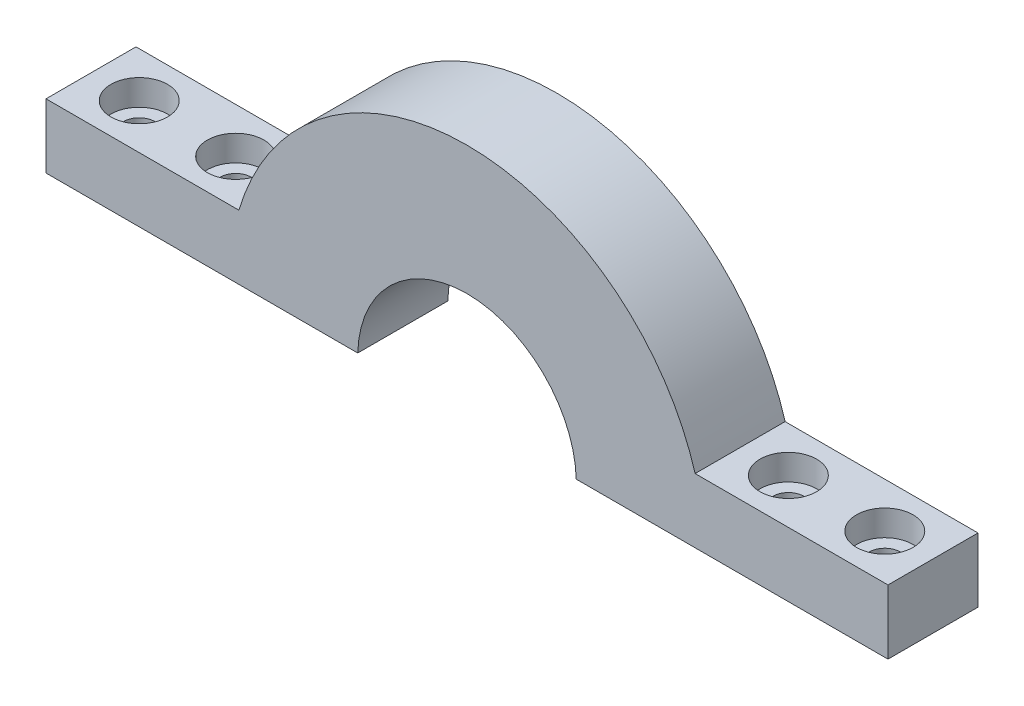
ISO-10303-21;
HEADER;
FILE_DESCRIPTION(('STEP AP214'),'2;1');
FILE_NAME('part.step','',(''),(''),'','','');
FILE_SCHEMA(('AUTOMOTIVE_DESIGN { 1 0 10303 214 1 1 1 1 }'));
ENDSEC;
DATA;
#1=APPLICATION_CONTEXT('core data for automotive mechanical design processes');
#2=APPLICATION_PROTOCOL_DEFINITION('international standard','automotive_design',2000,#1);
#3=PRODUCT_CONTEXT('',#1,'mechanical');
#4=PRODUCT('Part','Part','',(#3));
#5=PRODUCT_RELATED_PRODUCT_CATEGORY('part','',(#4));
#6=PRODUCT_DEFINITION_FORMATION('','',#4);
#7=PRODUCT_DEFINITION_CONTEXT('part definition',#1,'design');
#8=PRODUCT_DEFINITION('design','',#6,#7);
#9=PRODUCT_DEFINITION_SHAPE('','',#8);
#10=(LENGTH_UNIT() NAMED_UNIT(*) SI_UNIT(.MILLI.,.METRE.));
#11=(NAMED_UNIT(*) PLANE_ANGLE_UNIT() SI_UNIT($,.RADIAN.));
#12=(NAMED_UNIT(*) SI_UNIT($,.STERADIAN.) SOLID_ANGLE_UNIT());
#13=UNCERTAINTY_MEASURE_WITH_UNIT(LENGTH_MEASURE(1.E-05),#10,'distance_accuracy_value','');
#14=(GEOMETRIC_REPRESENTATION_CONTEXT(3) GLOBAL_UNCERTAINTY_ASSIGNED_CONTEXT((#13)) GLOBAL_UNIT_ASSIGNED_CONTEXT((#10,
#11,#12)) REPRESENTATION_CONTEXT('',''));
#15=CARTESIAN_POINT('',(0.,0.,0.));
#16=DIRECTION('',(0.,0.,1.));
#17=DIRECTION('',(1.,0.,0.));
#18=AXIS2_PLACEMENT_3D('',#15,#16,#17);
#19=CARTESIAN_POINT('',(-18.4983107336859,0.249999999999998,-7.));
#20=DIRECTION('',(0.,-1.,0.));
#21=DIRECTION('',(1.,0.,0.));
#22=AXIS2_PLACEMENT_3D('',#19,#20,#21);
#23=PLANE('',#22);
#24=CARTESIAN_POINT('',(-28.9894334746068,0.249999999999997,-3.5));
#25=DIRECTION('',(0.,1.,0.));
#26=DIRECTION('',(0.,0.,1.));
#27=AXIS2_PLACEMENT_3D('',#24,#25,#26);
#28=CIRCLE('',#27,1.2);
#29=CARTESIAN_POINT('',(-28.9894334746068,0.249999999999997,-2.3));
#30=VERTEX_POINT('',#29);
#31=EDGE_CURVE('E252',#30,#30,#28,.T.);
#32=ORIENTED_EDGE('',*,*,#31,.T.);
#33=EDGE_LOOP('',(#32));
#34=FACE_BOUND('',#33,.T.);
#35=CARTESIAN_POINT('',(-21.4894334746068,0.249999999999997,-3.5));
#36=DIRECTION('',(0.,1.,0.));
#37=DIRECTION('',(0.,0.,1.));
#38=AXIS2_PLACEMENT_3D('',#35,#36,#37);
#39=CIRCLE('',#38,1.2);
#40=CARTESIAN_POINT('',(-21.4894334746068,0.249999999999997,-2.3));
#41=VERTEX_POINT('',#40);
#42=EDGE_CURVE('E240',#41,#41,#39,.T.);
#43=ORIENTED_EDGE('',*,*,#42,.T.);
#44=EDGE_LOOP('',(#43));
#45=FACE_BOUND('',#44,.T.);
#46=DIRECTION('',(1.,0.,0.));
#47=VECTOR('',#46,1.);
#48=CARTESIAN_POINT('',(-18.4983107336859,0.249999999999998,0.));
#49=LINE('',#48,#47);
#50=CARTESIAN_POINT('',(-32.7394334746068,0.249999999999996,0.));
#51=VERTEX_POINT('',#50);
#52=CARTESIAN_POINT('',(-8.49632273398321,0.249999999999998,0.));
#53=VERTEX_POINT('',#52);
#54=EDGE_CURVE('E159',#51,#53,#49,.T.);
#55=ORIENTED_EDGE('',*,*,#54,.F.);
#56=DIRECTION('',(0.,0.,1.));
#57=VECTOR('',#56,1.);
#58=CARTESIAN_POINT('',(-32.7394334746068,0.249999999999996,-7.));
#59=LINE('',#58,#57);
#60=CARTESIAN_POINT('',(-32.7394334746068,0.249999999999996,-7.));
#61=VERTEX_POINT('',#60);
#62=EDGE_CURVE('E11',#61,#51,#59,.T.);
#63=ORIENTED_EDGE('',*,*,#62,.F.);
#64=DIRECTION('',(1.,0.,0.));
#65=VECTOR('',#64,1.);
#66=CARTESIAN_POINT('',(-18.4983107336859,0.249999999999998,-7.));
#67=LINE('',#66,#65);
#68=CARTESIAN_POINT('',(-8.49632273398321,0.249999999999998,-7.));
#69=VERTEX_POINT('',#68);
#70=EDGE_CURVE('E61',#61,#69,#67,.T.);
#71=ORIENTED_EDGE('',*,*,#70,.T.);
#72=DIRECTION('',(0.,0.,1.));
#73=VECTOR('',#72,1.);
#74=CARTESIAN_POINT('',(-8.49632273398321,0.249999999999998,-7.));
#75=LINE('',#74,#73);
#76=EDGE_CURVE('E46',#69,#53,#75,.T.);
#77=ORIENTED_EDGE('',*,*,#76,.T.);
#78=EDGE_LOOP('',(#55,#63,#71,#77));
#79=FACE_BOUND('',#78,.T.);
#80=ADVANCED_FACE('F42',(#34,#45,#79),#23,.T.);
#81=CARTESIAN_POINT('',(-32.7394334746068,0.249999999999996,-7.));
#82=DIRECTION('',(-1.,0.,0.));
#83=DIRECTION('',(0.,0.,1.));
#84=AXIS2_PLACEMENT_3D('',#81,#82,#83);
#85=PLANE('',#84);
#86=DIRECTION('',(0.,-1.,0.));
#87=VECTOR('',#86,1.);
#88=CARTESIAN_POINT('',(-32.7394334746068,0.249999999999996,0.));
#89=LINE('',#88,#87);
#90=CARTESIAN_POINT('',(-32.7394334746068,5.25,0.));
#91=VERTEX_POINT('',#90);
#92=EDGE_CURVE('E157',#91,#51,#89,.T.);
#93=ORIENTED_EDGE('',*,*,#92,.F.);
#94=DIRECTION('',(0.,0.,1.));
#95=VECTOR('',#94,1.);
#96=CARTESIAN_POINT('',(-32.7394334746068,5.25,-7.));
#97=LINE('',#96,#95);
#98=CARTESIAN_POINT('',(-32.7394334746068,5.25,-7.));
#99=VERTEX_POINT('',#98);
#100=EDGE_CURVE('E52',#99,#91,#97,.T.);
#101=ORIENTED_EDGE('',*,*,#100,.F.);
#102=DIRECTION('',(0.,-1.,0.));
#103=VECTOR('',#102,1.);
#104=CARTESIAN_POINT('',(-32.7394334746068,0.249999999999996,-7.));
#105=LINE('',#104,#103);
#106=EDGE_CURVE('E131',#99,#61,#105,.T.);
#107=ORIENTED_EDGE('',*,*,#106,.T.);
#108=ORIENTED_EDGE('',*,*,#62,.T.);
#109=EDGE_LOOP('',(#93,#101,#107,#108));
#110=FACE_BOUND('',#109,.T.);
#111=ADVANCED_FACE('F172',(#110),#85,.T.);
#112=CARTESIAN_POINT('',(-32.7394334746068,5.25,-7.));
#113=DIRECTION('',(0.,1.,0.));
#114=DIRECTION('',(0.,0.,1.));
#115=AXIS2_PLACEMENT_3D('',#112,#113,#114);
#116=PLANE('',#115);
#117=CARTESIAN_POINT('',(-28.9894334746068,5.25,-3.5));
#118=DIRECTION('',(0.,1.,0.));
#119=DIRECTION('',(0.,0.,1.));
#120=AXIS2_PLACEMENT_3D('',#117,#118,#119);
#121=CIRCLE('',#120,2.2);
#122=CARTESIAN_POINT('',(-28.9894334746068,5.25,-1.3));
#123=VERTEX_POINT('',#122);
#124=EDGE_CURVE('E261',#123,#123,#121,.T.);
#125=ORIENTED_EDGE('',*,*,#124,.F.);
#126=EDGE_LOOP('',(#125));
#127=FACE_BOUND('',#126,.T.);
#128=CARTESIAN_POINT('',(-21.4894334746068,5.25,-3.5));
#129=DIRECTION('',(0.,1.,0.));
#130=DIRECTION('',(0.,0.,1.));
#131=AXIS2_PLACEMENT_3D('',#128,#129,#130);
#132=CIRCLE('',#131,2.2);
#133=CARTESIAN_POINT('',(-21.4894334746068,5.25,-1.3));
#134=VERTEX_POINT('',#133);
#135=EDGE_CURVE('E249',#134,#134,#132,.T.);
#136=ORIENTED_EDGE('',*,*,#135,.F.);
#137=EDGE_LOOP('',(#136));
#138=FACE_BOUND('',#137,.T.);
#139=DIRECTION('',(-1.,0.,0.));
#140=VECTOR('',#139,1.);
#141=CARTESIAN_POINT('',(-32.7394334746068,5.25,0.));
#142=LINE('',#141,#140);
#143=CARTESIAN_POINT('',(-17.7394334746068,5.25,0.));
#144=VERTEX_POINT('',#143);
#145=EDGE_CURVE('E119',#144,#91,#142,.T.);
#146=ORIENTED_EDGE('',*,*,#145,.F.);
#147=DIRECTION('',(0.,0.,1.));
#148=VECTOR('',#147,1.);
#149=CARTESIAN_POINT('',(-17.7394334746068,5.25,-7.));
#150=LINE('',#149,#148);
#151=CARTESIAN_POINT('',(-17.7394334746068,5.25,-7.));
#152=VERTEX_POINT('',#151);
#153=EDGE_CURVE('E114',#152,#144,#150,.T.);
#154=ORIENTED_EDGE('',*,*,#153,.F.);
#155=DIRECTION('',(-1.,0.,0.));
#156=VECTOR('',#155,1.);
#157=CARTESIAN_POINT('',(-32.7394334746068,5.25,-7.));
#158=LINE('',#157,#156);
#159=EDGE_CURVE('E117',#152,#99,#158,.T.);
#160=ORIENTED_EDGE('',*,*,#159,.T.);
#161=ORIENTED_EDGE('',*,*,#100,.T.);
#162=EDGE_LOOP('',(#146,#154,#160,#161));
#163=FACE_BOUND('',#162,.T.);
#164=ADVANCED_FACE('F116',(#127,#138,#163),#116,.T.);
#165=CARTESIAN_POINT('',(0.,0.,-7.));
#166=DIRECTION('',(0.,0.,1.));
#167=DIRECTION('',(1.,0.,0.));
#168=AXIS2_PLACEMENT_3D('',#165,#166,#167);
#169=CYLINDRICAL_SURFACE('',#168,18.5);
#170=CARTESIAN_POINT('',(0.,0.,0.));
#171=DIRECTION('',(0.,0.,1.));
#172=DIRECTION('',(1.,0.,0.));
#173=AXIS2_PLACEMENT_3D('',#170,#171,#172);
#174=CIRCLE('',#173,18.5);
#175=CARTESIAN_POINT('',(17.7394334746068,5.25,0.));
#176=VERTEX_POINT('',#175);
#177=EDGE_CURVE('E154',#176,#144,#174,.T.);
#178=ORIENTED_EDGE('',*,*,#177,.F.);
#179=DIRECTION('',(0.,0.,1.));
#180=VECTOR('',#179,1.);
#181=CARTESIAN_POINT('',(17.7394334746068,5.25,-7.));
#182=LINE('',#181,#180);
#183=CARTESIAN_POINT('',(17.7394334746068,5.25,-7.));
#184=VERTEX_POINT('',#183);
#185=EDGE_CURVE('E124',#184,#176,#182,.T.);
#186=ORIENTED_EDGE('',*,*,#185,.F.);
#187=CARTESIAN_POINT('',(0.,0.,-7.));
#188=DIRECTION('',(0.,0.,1.));
#189=DIRECTION('',(1.,0.,0.));
#190=AXIS2_PLACEMENT_3D('',#187,#188,#189);
#191=CIRCLE('',#190,18.5);
#192=EDGE_CURVE('E129',#184,#152,#191,.T.);
#193=ORIENTED_EDGE('',*,*,#192,.T.);
#194=ORIENTED_EDGE('',*,*,#153,.T.);
#195=EDGE_LOOP('',(#178,#186,#193,#194));
#196=FACE_BOUND('',#195,.T.);
#197=ADVANCED_FACE('F133',(#196),#169,.T.);
#198=CARTESIAN_POINT('',(32.7394334746068,5.25,-7.));
#199=DIRECTION('',(0.,1.,0.));
#200=DIRECTION('',(0.,0.,1.));
#201=AXIS2_PLACEMENT_3D('',#198,#199,#200);
#202=PLANE('',#201);
#203=CARTESIAN_POINT('',(21.4894334746068,5.25,-3.5));
#204=DIRECTION('',(0.,1.,0.));
#205=DIRECTION('',(0.,0.,1.));
#206=AXIS2_PLACEMENT_3D('',#203,#204,#205);
#207=CIRCLE('',#206,2.2);
#208=CARTESIAN_POINT('',(21.4894334746068,5.25,-1.3));
#209=VERTEX_POINT('',#208);
#210=EDGE_CURVE('E237',#209,#209,#207,.T.);
#211=ORIENTED_EDGE('',*,*,#210,.F.);
#212=EDGE_LOOP('',(#211));
#213=FACE_BOUND('',#212,.T.);
#214=CARTESIAN_POINT('',(28.9894334746068,5.25,-3.5));
#215=DIRECTION('',(0.,1.,0.));
#216=DIRECTION('',(0.,0.,1.));
#217=AXIS2_PLACEMENT_3D('',#214,#215,#216);
#218=CIRCLE('',#217,2.2);
#219=CARTESIAN_POINT('',(28.9894334746068,5.25,-1.3));
#220=VERTEX_POINT('',#219);
#221=EDGE_CURVE('E227',#220,#220,#218,.T.);
#222=ORIENTED_EDGE('',*,*,#221,.F.);
#223=EDGE_LOOP('',(#222));
#224=FACE_BOUND('',#223,.T.);
#225=DIRECTION('',(-1.,0.,0.));
#226=VECTOR('',#225,1.);
#227=CARTESIAN_POINT('',(32.7394334746068,5.25,0.));
#228=LINE('',#227,#226);
#229=CARTESIAN_POINT('',(32.7394334746068,5.25,0.));
#230=VERTEX_POINT('',#229);
#231=EDGE_CURVE('E151',#230,#176,#228,.T.);
#232=ORIENTED_EDGE('',*,*,#231,.F.);
#233=DIRECTION('',(0.,0.,1.));
#234=VECTOR('',#233,1.);
#235=CARTESIAN_POINT('',(32.7394334746068,5.25,-7.));
#236=LINE('',#235,#234);
#237=CARTESIAN_POINT('',(32.7394334746068,5.25,-7.));
#238=VERTEX_POINT('',#237);
#239=EDGE_CURVE('E163',#238,#230,#236,.T.);
#240=ORIENTED_EDGE('',*,*,#239,.F.);
#241=DIRECTION('',(-1.,0.,0.));
#242=VECTOR('',#241,1.);
#243=CARTESIAN_POINT('',(32.7394334746068,5.25,-7.));
#244=LINE('',#243,#242);
#245=EDGE_CURVE('E134',#238,#184,#244,.T.);
#246=ORIENTED_EDGE('',*,*,#245,.T.);
#247=ORIENTED_EDGE('',*,*,#185,.T.);
#248=EDGE_LOOP('',(#232,#240,#246,#247));
#249=FACE_BOUND('',#248,.T.);
#250=ADVANCED_FACE('F187',(#213,#224,#249),#202,.T.);
#251=CARTESIAN_POINT('',(32.7394334746068,0.249999999999996,-7.));
#252=DIRECTION('',(1.,0.,0.));
#253=DIRECTION('',(0.,0.,-1.));
#254=AXIS2_PLACEMENT_3D('',#251,#252,#253);
#255=PLANE('',#254);
#256=DIRECTION('',(0.,1.,0.));
#257=VECTOR('',#256,1.);
#258=CARTESIAN_POINT('',(32.7394334746068,0.249999999999996,0.));
#259=LINE('',#258,#257);
#260=CARTESIAN_POINT('',(32.7394334746068,0.249999999999996,0.));
#261=VERTEX_POINT('',#260);
#262=EDGE_CURVE('E148',#261,#230,#259,.T.);
#263=ORIENTED_EDGE('',*,*,#262,.F.);
#264=DIRECTION('',(0.,0.,1.));
#265=VECTOR('',#264,1.);
#266=CARTESIAN_POINT('',(32.7394334746068,0.249999999999996,-7.));
#267=LINE('',#266,#265);
#268=CARTESIAN_POINT('',(32.7394334746068,0.249999999999996,-7.));
#269=VERTEX_POINT('',#268);
#270=EDGE_CURVE('E165',#269,#261,#267,.T.);
#271=ORIENTED_EDGE('',*,*,#270,.F.);
#272=DIRECTION('',(0.,1.,0.));
#273=VECTOR('',#272,1.);
#274=CARTESIAN_POINT('',(32.7394334746068,0.249999999999996,-7.));
#275=LINE('',#274,#273);
#276=EDGE_CURVE('E136',#269,#238,#275,.T.);
#277=ORIENTED_EDGE('',*,*,#276,.T.);
#278=ORIENTED_EDGE('',*,*,#239,.T.);
#279=EDGE_LOOP('',(#263,#271,#277,#278));
#280=FACE_BOUND('',#279,.T.);
#281=ADVANCED_FACE('F190',(#280),#255,.T.);
#282=CARTESIAN_POINT('',(18.4983107336859,0.249999999999998,-7.));
#283=DIRECTION('',(0.,-1.,0.));
#284=DIRECTION('',(1.,0.,0.));
#285=AXIS2_PLACEMENT_3D('',#282,#283,#284);
#286=PLANE('',#285);
#287=CARTESIAN_POINT('',(21.4894334746068,0.249999999999997,-3.5));
#288=DIRECTION('',(0.,1.,0.));
#289=DIRECTION('',(0.,0.,1.));
#290=AXIS2_PLACEMENT_3D('',#287,#288,#289);
#291=CIRCLE('',#290,1.2);
#292=CARTESIAN_POINT('',(21.4894334746068,0.249999999999997,-2.3));
#293=VERTEX_POINT('',#292);
#294=EDGE_CURVE('E203',#293,#293,#291,.T.);
#295=ORIENTED_EDGE('',*,*,#294,.T.);
#296=EDGE_LOOP('',(#295));
#297=FACE_BOUND('',#296,.T.);
#298=CARTESIAN_POINT('',(28.9894334746068,0.249999999999997,-3.5));
#299=DIRECTION('',(0.,1.,0.));
#300=DIRECTION('',(0.,0.,1.));
#301=AXIS2_PLACEMENT_3D('',#298,#299,#300);
#302=CIRCLE('',#301,1.2);
#303=CARTESIAN_POINT('',(28.9894334746068,0.249999999999997,-2.3));
#304=VERTEX_POINT('',#303);
#305=EDGE_CURVE('E145',#304,#304,#302,.T.);
#306=ORIENTED_EDGE('',*,*,#305,.T.);
#307=EDGE_LOOP('',(#306));
#308=FACE_BOUND('',#307,.T.);
#309=DIRECTION('',(1.,0.,0.));
#310=VECTOR('',#309,1.);
#311=CARTESIAN_POINT('',(18.4983107336859,0.249999999999998,0.));
#312=LINE('',#311,#310);
#313=CARTESIAN_POINT('',(8.49632273398321,0.249999999999998,0.));
#314=VERTEX_POINT('',#313);
#315=EDGE_CURVE('E144',#314,#261,#312,.T.);
#316=ORIENTED_EDGE('',*,*,#315,.F.);
#317=DIRECTION('',(0.,0.,1.));
#318=VECTOR('',#317,1.);
#319=CARTESIAN_POINT('',(8.49632273398321,0.249999999999998,-7.));
#320=LINE('',#319,#318);
#321=CARTESIAN_POINT('',(8.49632273398321,0.249999999999998,-7.));
#322=VERTEX_POINT('',#321);
#323=EDGE_CURVE('E166',#322,#314,#320,.T.);
#324=ORIENTED_EDGE('',*,*,#323,.F.);
#325=DIRECTION('',(1.,0.,0.));
#326=VECTOR('',#325,1.);
#327=CARTESIAN_POINT('',(18.4983107336859,0.249999999999998,-7.));
#328=LINE('',#327,#326);
#329=EDGE_CURVE('E210',#322,#269,#328,.T.);
#330=ORIENTED_EDGE('',*,*,#329,.T.);
#331=ORIENTED_EDGE('',*,*,#270,.T.);
#332=EDGE_LOOP('',(#316,#324,#330,#331));
#333=FACE_BOUND('',#332,.T.);
#334=ADVANCED_FACE('F193',(#297,#308,#333),#286,.T.);
#335=CARTESIAN_POINT('',(0.,0.,-7.));
#336=DIRECTION('',(0.,0.,1.));
#337=DIRECTION('',(1.,0.,0.));
#338=AXIS2_PLACEMENT_3D('',#335,#336,#337);
#339=CYLINDRICAL_SURFACE('',#338,8.5);
#340=CARTESIAN_POINT('',(0.,0.,0.));
#341=DIRECTION('',(0.,0.,-1.));
#342=DIRECTION('',(1.,0.,0.));
#343=AXIS2_PLACEMENT_3D('',#340,#341,#342);
#344=CIRCLE('',#343,8.5);
#345=EDGE_CURVE('E141',#53,#314,#344,.T.);
#346=ORIENTED_EDGE('',*,*,#345,.F.);
#347=ORIENTED_EDGE('',*,*,#76,.F.);
#348=CARTESIAN_POINT('',(0.,0.,-7.));
#349=DIRECTION('',(0.,0.,-1.));
#350=DIRECTION('',(1.,0.,0.));
#351=AXIS2_PLACEMENT_3D('',#348,#349,#350);
#352=CIRCLE('',#351,8.5);
#353=EDGE_CURVE('E215',#69,#322,#352,.T.);
#354=ORIENTED_EDGE('',*,*,#353,.T.);
#355=ORIENTED_EDGE('',*,*,#323,.T.);
#356=EDGE_LOOP('',(#346,#347,#354,#355));
#357=FACE_BOUND('',#356,.T.);
#358=ADVANCED_FACE('F44',(#357),#339,.F.);
#359=CARTESIAN_POINT('',(0.,0.,-7.));
#360=DIRECTION('',(0.,0.,1.));
#361=DIRECTION('',(1.,0.,0.));
#362=AXIS2_PLACEMENT_3D('',#359,#360,#361);
#363=PLANE('',#362);
#364=ORIENTED_EDGE('',*,*,#70,.F.);
#365=ORIENTED_EDGE('',*,*,#106,.F.);
#366=ORIENTED_EDGE('',*,*,#159,.F.);
#367=ORIENTED_EDGE('',*,*,#192,.F.);
#368=ORIENTED_EDGE('',*,*,#245,.F.);
#369=ORIENTED_EDGE('',*,*,#276,.F.);
#370=ORIENTED_EDGE('',*,*,#329,.F.);
#371=ORIENTED_EDGE('',*,*,#353,.F.);
#372=EDGE_LOOP('',(#364,#365,#366,#367,#368,#369,#370,#371));
#373=FACE_BOUND('',#372,.T.);
#374=ADVANCED_FACE('F127',(#373),#363,.F.);
#375=CARTESIAN_POINT('',(0.,0.,0.));
#376=DIRECTION('',(0.,0.,1.));
#377=DIRECTION('',(1.,0.,0.));
#378=AXIS2_PLACEMENT_3D('',#375,#376,#377);
#379=PLANE('',#378);
#380=ORIENTED_EDGE('',*,*,#54,.T.);
#381=ORIENTED_EDGE('',*,*,#345,.T.);
#382=ORIENTED_EDGE('',*,*,#315,.T.);
#383=ORIENTED_EDGE('',*,*,#262,.T.);
#384=ORIENTED_EDGE('',*,*,#231,.T.);
#385=ORIENTED_EDGE('',*,*,#177,.T.);
#386=ORIENTED_EDGE('',*,*,#145,.T.);
#387=ORIENTED_EDGE('',*,*,#92,.T.);
#388=EDGE_LOOP('',(#380,#381,#382,#383,#384,#385,#386,#387));
#389=FACE_BOUND('',#388,.T.);
#390=ADVANCED_FACE('F171',(#389),#379,.T.);
#391=CARTESIAN_POINT('',(28.9894334746068,5.25,-3.5));
#392=DIRECTION('',(0.,1.,0.));
#393=DIRECTION('',(0.,0.,1.));
#394=AXIS2_PLACEMENT_3D('',#391,#392,#393);
#395=CYLINDRICAL_SURFACE('',#394,1.2);
#396=ORIENTED_EDGE('',*,*,#305,.F.);
#397=EDGE_LOOP('',(#396));
#398=FACE_BOUND('',#397,.T.);
#399=CARTESIAN_POINT('',(28.9894334746068,3.25,-3.5));
#400=DIRECTION('',(0.,1.,0.));
#401=DIRECTION('',(0.,0.,1.));
#402=AXIS2_PLACEMENT_3D('',#399,#400,#401);
#403=CIRCLE('',#402,1.2);
#404=CARTESIAN_POINT('',(28.9894334746068,3.25,-2.3));
#405=VERTEX_POINT('',#404);
#406=EDGE_CURVE('E221',#405,#405,#403,.T.);
#407=ORIENTED_EDGE('',*,*,#406,.T.);
#408=EDGE_LOOP('',(#407));
#409=FACE_BOUND('',#408,.T.);
#410=ADVANCED_FACE('F310',(#398,#409),#395,.F.);
#411=CARTESIAN_POINT('',(30.1894334746068,3.25,-3.5));
#412=DIRECTION('',(0.,-1.,0.));
#413=DIRECTION('',(0.,0.,-1.));
#414=AXIS2_PLACEMENT_3D('',#411,#412,#413);
#415=PLANE('',#414);
#416=ORIENTED_EDGE('',*,*,#406,.F.);
#417=EDGE_LOOP('',(#416));
#418=FACE_BOUND('',#417,.T.);
#419=CARTESIAN_POINT('',(28.9894334746068,3.25,-3.5));
#420=DIRECTION('',(0.,1.,0.));
#421=DIRECTION('',(0.,0.,1.));
#422=AXIS2_PLACEMENT_3D('',#419,#420,#421);
#423=CIRCLE('',#422,2.2);
#424=CARTESIAN_POINT('',(28.9894334746068,3.25,-1.3));
#425=VERTEX_POINT('',#424);
#426=EDGE_CURVE('E224',#425,#425,#423,.T.);
#427=ORIENTED_EDGE('',*,*,#426,.T.);
#428=EDGE_LOOP('',(#427));
#429=FACE_BOUND('',#428,.T.);
#430=ADVANCED_FACE('F306',(#418,#429),#415,.F.);
#431=CARTESIAN_POINT('',(28.9894334746068,5.25,-3.5));
#432=DIRECTION('',(0.,1.,0.));
#433=DIRECTION('',(0.,0.,1.));
#434=AXIS2_PLACEMENT_3D('',#431,#432,#433);
#435=CYLINDRICAL_SURFACE('',#434,2.2);
#436=ORIENTED_EDGE('',*,*,#426,.F.);
#437=EDGE_LOOP('',(#436));
#438=FACE_BOUND('',#437,.T.);
#439=ORIENTED_EDGE('',*,*,#221,.T.);
#440=EDGE_LOOP('',(#439));
#441=FACE_BOUND('',#440,.T.);
#442=ADVANCED_FACE('F302',(#438,#441),#435,.F.);
#443=CARTESIAN_POINT('',(21.4894334746068,5.25,-3.5));
#444=DIRECTION('',(0.,1.,0.));
#445=DIRECTION('',(0.,0.,1.));
#446=AXIS2_PLACEMENT_3D('',#443,#444,#445);
#447=CYLINDRICAL_SURFACE('',#446,1.2);
#448=ORIENTED_EDGE('',*,*,#294,.F.);
#449=EDGE_LOOP('',(#448));
#450=FACE_BOUND('',#449,.T.);
#451=CARTESIAN_POINT('',(21.4894334746068,3.25,-3.5));
#452=DIRECTION('',(0.,1.,0.));
#453=DIRECTION('',(0.,0.,1.));
#454=AXIS2_PLACEMENT_3D('',#451,#452,#453);
#455=CIRCLE('',#454,1.2);
#456=CARTESIAN_POINT('',(21.4894334746068,3.25,-2.3));
#457=VERTEX_POINT('',#456);
#458=EDGE_CURVE('E231',#457,#457,#455,.T.);
#459=ORIENTED_EDGE('',*,*,#458,.T.);
#460=EDGE_LOOP('',(#459));
#461=FACE_BOUND('',#460,.T.);
#462=ADVANCED_FACE('F298',(#450,#461),#447,.F.);
#463=CARTESIAN_POINT('',(22.6894334746068,3.25,-3.5));
#464=DIRECTION('',(0.,-1.,0.));
#465=DIRECTION('',(0.,0.,-1.));
#466=AXIS2_PLACEMENT_3D('',#463,#464,#465);
#467=PLANE('',#466);
#468=ORIENTED_EDGE('',*,*,#458,.F.);
#469=EDGE_LOOP('',(#468));
#470=FACE_BOUND('',#469,.T.);
#471=CARTESIAN_POINT('',(21.4894334746068,3.25,-3.5));
#472=DIRECTION('',(0.,1.,0.));
#473=DIRECTION('',(0.,0.,1.));
#474=AXIS2_PLACEMENT_3D('',#471,#472,#473);
#475=CIRCLE('',#474,2.2);
#476=CARTESIAN_POINT('',(21.4894334746068,3.25,-1.3));
#477=VERTEX_POINT('',#476);
#478=EDGE_CURVE('E234',#477,#477,#475,.T.);
#479=ORIENTED_EDGE('',*,*,#478,.T.);
#480=EDGE_LOOP('',(#479));
#481=FACE_BOUND('',#480,.T.);
#482=ADVANCED_FACE('F294',(#470,#481),#467,.F.);
#483=CARTESIAN_POINT('',(21.4894334746068,5.25,-3.5));
#484=DIRECTION('',(0.,1.,0.));
#485=DIRECTION('',(0.,0.,1.));
#486=AXIS2_PLACEMENT_3D('',#483,#484,#485);
#487=CYLINDRICAL_SURFACE('',#486,2.2);
#488=ORIENTED_EDGE('',*,*,#478,.F.);
#489=EDGE_LOOP('',(#488));
#490=FACE_BOUND('',#489,.T.);
#491=ORIENTED_EDGE('',*,*,#210,.T.);
#492=EDGE_LOOP('',(#491));
#493=FACE_BOUND('',#492,.T.);
#494=ADVANCED_FACE('F290',(#490,#493),#487,.F.);
#495=CARTESIAN_POINT('',(-21.4894334746068,5.25,-3.5));
#496=DIRECTION('',(0.,1.,0.));
#497=DIRECTION('',(0.,0.,1.));
#498=AXIS2_PLACEMENT_3D('',#495,#496,#497);
#499=CYLINDRICAL_SURFACE('',#498,1.2);
#500=ORIENTED_EDGE('',*,*,#42,.F.);
#501=EDGE_LOOP('',(#500));
#502=FACE_BOUND('',#501,.T.);
#503=CARTESIAN_POINT('',(-21.4894334746068,3.25,-3.5));
#504=DIRECTION('',(0.,1.,0.));
#505=DIRECTION('',(0.,0.,1.));
#506=AXIS2_PLACEMENT_3D('',#503,#504,#505);
#507=CIRCLE('',#506,1.2);
#508=CARTESIAN_POINT('',(-21.4894334746068,3.25,-2.3));
#509=VERTEX_POINT('',#508);
#510=EDGE_CURVE('E243',#509,#509,#507,.T.);
#511=ORIENTED_EDGE('',*,*,#510,.T.);
#512=EDGE_LOOP('',(#511));
#513=FACE_BOUND('',#512,.T.);
#514=ADVANCED_FACE('F282',(#502,#513),#499,.F.);
#515=CARTESIAN_POINT('',(-20.2894334746068,3.25,-3.5));
#516=DIRECTION('',(0.,-1.,0.));
#517=DIRECTION('',(0.,0.,-1.));
#518=AXIS2_PLACEMENT_3D('',#515,#516,#517);
#519=PLANE('',#518);
#520=ORIENTED_EDGE('',*,*,#510,.F.);
#521=EDGE_LOOP('',(#520));
#522=FACE_BOUND('',#521,.T.);
#523=CARTESIAN_POINT('',(-21.4894334746068,3.25,-3.5));
#524=DIRECTION('',(0.,1.,0.));
#525=DIRECTION('',(0.,0.,1.));
#526=AXIS2_PLACEMENT_3D('',#523,#524,#525);
#527=CIRCLE('',#526,2.2);
#528=CARTESIAN_POINT('',(-21.4894334746068,3.25,-1.3));
#529=VERTEX_POINT('',#528);
#530=EDGE_CURVE('E246',#529,#529,#527,.T.);
#531=ORIENTED_EDGE('',*,*,#530,.T.);
#532=EDGE_LOOP('',(#531));
#533=FACE_BOUND('',#532,.T.);
#534=ADVANCED_FACE('F272',(#522,#533),#519,.F.);
#535=CARTESIAN_POINT('',(-21.4894334746068,5.25,-3.5));
#536=DIRECTION('',(0.,1.,0.));
#537=DIRECTION('',(0.,0.,1.));
#538=AXIS2_PLACEMENT_3D('',#535,#536,#537);
#539=CYLINDRICAL_SURFACE('',#538,2.2);
#540=ORIENTED_EDGE('',*,*,#530,.F.);
#541=EDGE_LOOP('',(#540));
#542=FACE_BOUND('',#541,.T.);
#543=ORIENTED_EDGE('',*,*,#135,.T.);
#544=EDGE_LOOP('',(#543));
#545=FACE_BOUND('',#544,.T.);
#546=ADVANCED_FACE('F269',(#542,#545),#539,.F.);
#547=CARTESIAN_POINT('',(-28.9894334746068,5.25,-3.5));
#548=DIRECTION('',(0.,1.,0.));
#549=DIRECTION('',(0.,0.,1.));
#550=AXIS2_PLACEMENT_3D('',#547,#548,#549);
#551=CYLINDRICAL_SURFACE('',#550,1.2);
#552=ORIENTED_EDGE('',*,*,#31,.F.);
#553=EDGE_LOOP('',(#552));
#554=FACE_BOUND('',#553,.T.);
#555=CARTESIAN_POINT('',(-28.9894334746068,3.25,-3.5));
#556=DIRECTION('',(0.,1.,0.));
#557=DIRECTION('',(0.,0.,1.));
#558=AXIS2_PLACEMENT_3D('',#555,#556,#557);
#559=CIRCLE('',#558,1.2);
#560=CARTESIAN_POINT('',(-28.9894334746068,3.25,-2.3));
#561=VERTEX_POINT('',#560);
#562=EDGE_CURVE('E255',#561,#561,#559,.T.);
#563=ORIENTED_EDGE('',*,*,#562,.T.);
#564=EDGE_LOOP('',(#563));
#565=FACE_BOUND('',#564,.T.);
#566=ADVANCED_FACE('F271',(#554,#565),#551,.F.);
#567=CARTESIAN_POINT('',(-27.7894334746068,3.25,-3.5));
#568=DIRECTION('',(0.,-1.,0.));
#569=DIRECTION('',(0.,0.,-1.));
#570=AXIS2_PLACEMENT_3D('',#567,#568,#569);
#571=PLANE('',#570);
#572=ORIENTED_EDGE('',*,*,#562,.F.);
#573=EDGE_LOOP('',(#572));
#574=FACE_BOUND('',#573,.T.);
#575=CARTESIAN_POINT('',(-28.9894334746068,3.25,-3.5));
#576=DIRECTION('',(0.,1.,0.));
#577=DIRECTION('',(0.,0.,1.));
#578=AXIS2_PLACEMENT_3D('',#575,#576,#577);
#579=CIRCLE('',#578,2.2);
#580=CARTESIAN_POINT('',(-28.9894334746068,3.25,-1.3));
#581=VERTEX_POINT('',#580);
#582=EDGE_CURVE('E258',#581,#581,#579,.T.);
#583=ORIENTED_EDGE('',*,*,#582,.T.);
#584=EDGE_LOOP('',(#583));
#585=FACE_BOUND('',#584,.T.);
#586=ADVANCED_FACE('F279',(#574,#585),#571,.F.);
#587=CARTESIAN_POINT('',(-28.9894334746068,5.25,-3.5));
#588=DIRECTION('',(0.,1.,0.));
#589=DIRECTION('',(0.,0.,1.));
#590=AXIS2_PLACEMENT_3D('',#587,#588,#589);
#591=CYLINDRICAL_SURFACE('',#590,2.2);
#592=ORIENTED_EDGE('',*,*,#582,.F.);
#593=EDGE_LOOP('',(#592));
#594=FACE_BOUND('',#593,.T.);
#595=ORIENTED_EDGE('',*,*,#124,.T.);
#596=EDGE_LOOP('',(#595));
#597=FACE_BOUND('',#596,.T.);
#598=ADVANCED_FACE('F265',(#594,#597),#591,.F.);
#599=CLOSED_SHELL('',(#80,#111,#164,#197,#250,#281,#334,#358,#374,#390,#410,#430,#442,#462,#482,
#494,#514,#534,#546,#566,#586,#598));
#600=MANIFOLD_SOLID_BREP('B2',#599);
#601=ADVANCED_BREP_SHAPE_REPRESENTATION('',(#18,#600),#14);
#602=SHAPE_DEFINITION_REPRESENTATION(#9,#601);
ENDSEC;
END-ISO-10303-21;
